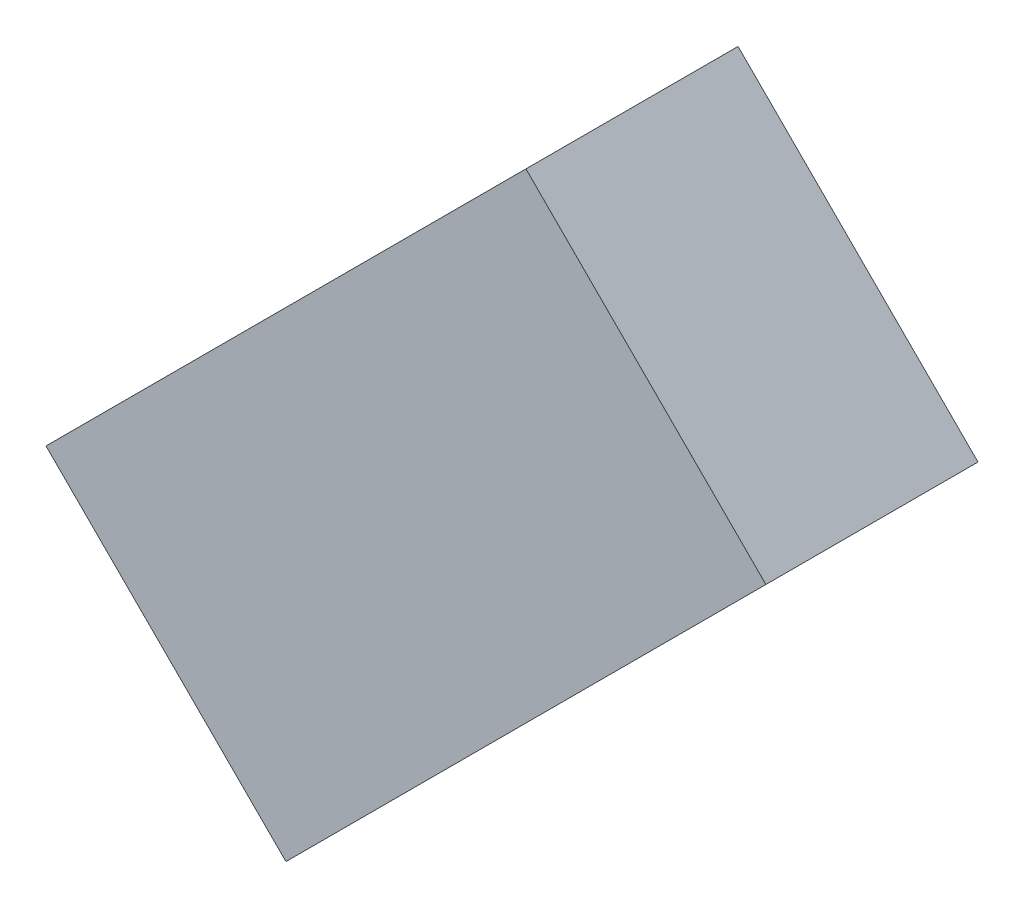
ISO-10303-21;
HEADER;
FILE_DESCRIPTION(('STEP AP214'),'2;1');
FILE_NAME('part.step','',(''),(''),'','','');
FILE_SCHEMA(('AUTOMOTIVE_DESIGN { 1 0 10303 214 1 1 1 1 }'));
ENDSEC;
DATA;
#1=APPLICATION_CONTEXT('core data for automotive mechanical design processes');
#2=APPLICATION_PROTOCOL_DEFINITION('international standard','automotive_design',2000,#1);
#3=PRODUCT_CONTEXT('',#1,'mechanical');
#4=PRODUCT('Part','Part','',(#3));
#5=PRODUCT_RELATED_PRODUCT_CATEGORY('part','',(#4));
#6=PRODUCT_DEFINITION_FORMATION('','',#4);
#7=PRODUCT_DEFINITION_CONTEXT('part definition',#1,'design');
#8=PRODUCT_DEFINITION('design','',#6,#7);
#9=PRODUCT_DEFINITION_SHAPE('','',#8);
#10=(LENGTH_UNIT() NAMED_UNIT(*) SI_UNIT(.MILLI.,.METRE.));
#11=(NAMED_UNIT(*) PLANE_ANGLE_UNIT() SI_UNIT($,.RADIAN.));
#12=(NAMED_UNIT(*) SI_UNIT($,.STERADIAN.) SOLID_ANGLE_UNIT());
#13=UNCERTAINTY_MEASURE_WITH_UNIT(LENGTH_MEASURE(1.E-05),#10,'distance_accuracy_value','');
#14=(GEOMETRIC_REPRESENTATION_CONTEXT(3) GLOBAL_UNCERTAINTY_ASSIGNED_CONTEXT((#13)) GLOBAL_UNIT_ASSIGNED_CONTEXT((#10,
#11,#12)) REPRESENTATION_CONTEXT('',''));
#15=CARTESIAN_POINT('',(0.,0.,0.));
#16=DIRECTION('',(0.,0.,1.));
#17=DIRECTION('',(1.,0.,0.));
#18=AXIS2_PLACEMENT_3D('',#15,#16,#17);
#19=CARTESIAN_POINT('',(0.84853018,0.28284932,0.499999));
#20=DIRECTION('',(0.,0.,-1.));
#21=DIRECTION('',(-1.,0.,0.));
#22=AXIS2_PLACEMENT_3D('',#19,#20,#21);
#23=PLANE('',#22);
#24=DIRECTION('',(0.707106781186548,0.707106781186548,0.));
#25=VECTOR('',#24,1.);
#26=CARTESIAN_POINT('',(0.28284424,0.84853018,0.499999));
#27=LINE('',#26,#25);
#28=CARTESIAN_POINT('',(0.282844239999973,0.848530179999973,0.499999));
#29=VERTEX_POINT('',#28);
#30=CARTESIAN_POINT('',(-0.84852764,-0.2828417,0.499999));
#31=VERTEX_POINT('',#30);
#32=EDGE_CURVE('E54',#29,#31,#27,.F.);
#33=ORIENTED_EDGE('',*,*,#32,.T.);
#34=DIRECTION('',(-0.707103606167919,0.707109956190919,0.));
#35=VECTOR('',#34,1.);
#36=CARTESIAN_POINT('',(-0.84852764,-0.2828417,0.499999));
#37=LINE('',#36,#35);
#38=CARTESIAN_POINT('',(-0.282846780000027,-0.848527640000027,0.499999));
#39=VERTEX_POINT('',#38);
#40=EDGE_CURVE('E57',#31,#39,#37,.F.);
#41=ORIENTED_EDGE('',*,*,#40,.T.);
#42=DIRECTION('',(-0.707106781186548,-0.707106781186548,0.));
#43=VECTOR('',#42,1.);
#44=CARTESIAN_POINT('',(-0.28284678,-0.84852764,0.499999));
#45=LINE('',#44,#43);
#46=CARTESIAN_POINT('',(0.84853018,0.28284932,0.499999));
#47=VERTEX_POINT('',#46);
#48=EDGE_CURVE('E59',#39,#47,#45,.F.);
#49=ORIENTED_EDGE('',*,*,#48,.T.);
#50=DIRECTION('',(0.707109956190785,-0.707103606168054,0.));
#51=VECTOR('',#50,1.);
#52=CARTESIAN_POINT('',(0.28284424,0.84853018,0.499999));
#53=LINE('',#52,#51);
#54=EDGE_CURVE('E19',#29,#47,#53,.T.);
#55=ORIENTED_EDGE('',*,*,#54,.F.);
#56=EDGE_LOOP('',(#33,#41,#49,#55));
#57=FACE_BOUND('',#56,.T.);
#58=ADVANCED_FACE('F16',(#57),#23,.F.);
#59=CARTESIAN_POINT('',(-0.28284678,-0.84852764,0.));
#60=DIRECTION('',(-0.707106781186548,0.707106781186548,0.));
#61=DIRECTION('',(-0.707106781186548,-0.707106781186548,0.));
#62=AXIS2_PLACEMENT_3D('',#59,#60,#61);
#63=PLANE('',#62);
#64=DIRECTION('',(0.,0.,1.));
#65=VECTOR('',#64,1.);
#66=CARTESIAN_POINT('',(0.84853018,0.28284932,0.));
#67=LINE('',#66,#65);
#68=CARTESIAN_POINT('',(0.84853018,0.28284932,0.));
#69=VERTEX_POINT('',#68);
#70=EDGE_CURVE('E70',#69,#47,#67,.T.);
#71=ORIENTED_EDGE('',*,*,#70,.T.);
#72=ORIENTED_EDGE('',*,*,#48,.F.);
#73=DIRECTION('',(0.,0.,1.));
#74=VECTOR('',#73,1.);
#75=CARTESIAN_POINT('',(-0.282846780000108,-0.848527640000108,0.));
#76=LINE('',#75,#74);
#77=CARTESIAN_POINT('',(-0.282846780000027,-0.848527640000027,0.));
#78=VERTEX_POINT('',#77);
#79=EDGE_CURVE('E64',#39,#78,#76,.F.);
#80=ORIENTED_EDGE('',*,*,#79,.T.);
#81=DIRECTION('',(-0.707106781186548,-0.707106781186548,0.));
#82=VECTOR('',#81,1.);
#83=CARTESIAN_POINT('',(0.84853018,0.28284932,0.));
#84=LINE('',#83,#82);
#85=EDGE_CURVE('E82',#69,#78,#84,.T.);
#86=ORIENTED_EDGE('',*,*,#85,.F.);
#87=EDGE_LOOP('',(#71,#72,#80,#86));
#88=FACE_BOUND('',#87,.T.);
#89=ADVANCED_FACE('F67',(#88),#63,.F.);
#90=CARTESIAN_POINT('',(-0.84852764,-0.2828417,0.));
#91=DIRECTION('',(0.707109956190919,0.707103606167919,0.));
#92=DIRECTION('',(-0.707103606167919,0.707109956190919,0.));
#93=AXIS2_PLACEMENT_3D('',#90,#91,#92);
#94=PLANE('',#93);
#95=ORIENTED_EDGE('',*,*,#79,.F.);
#96=ORIENTED_EDGE('',*,*,#40,.F.);
#97=DIRECTION('',(0.,0.,1.));
#98=VECTOR('',#97,1.);
#99=CARTESIAN_POINT('',(-0.84852764,-0.2828417,0.));
#100=LINE('',#99,#98);
#101=CARTESIAN_POINT('',(-0.84852764,-0.2828417,0.));
#102=VERTEX_POINT('',#101);
#103=EDGE_CURVE('E76',#31,#102,#100,.F.);
#104=ORIENTED_EDGE('',*,*,#103,.T.);
#105=DIRECTION('',(-0.707103606168054,0.707109956190785,0.));
#106=VECTOR('',#105,1.);
#107=CARTESIAN_POINT('',(-0.28284678,-0.84852764,0.));
#108=LINE('',#107,#106);
#109=EDGE_CURVE('E73',#78,#102,#108,.T.);
#110=ORIENTED_EDGE('',*,*,#109,.F.);
#111=EDGE_LOOP('',(#95,#96,#104,#110));
#112=FACE_BOUND('',#111,.T.);
#113=ADVANCED_FACE('F71',(#112),#94,.F.);
#114=CARTESIAN_POINT('',(0.28284424,0.84853018,0.));
#115=DIRECTION('',(0.707106781186548,-0.707106781186548,0.));
#116=DIRECTION('',(0.707106781186548,0.707106781186548,0.));
#117=AXIS2_PLACEMENT_3D('',#114,#115,#116);
#118=PLANE('',#117);
#119=ORIENTED_EDGE('',*,*,#103,.F.);
#120=ORIENTED_EDGE('',*,*,#32,.F.);
#121=DIRECTION('',(0.,0.,1.));
#122=VECTOR('',#121,1.);
#123=CARTESIAN_POINT('',(0.282844239999892,0.848530179999892,0.));
#124=LINE('',#123,#122);
#125=CARTESIAN_POINT('',(0.282844239999973,0.848530179999973,0.));
#126=VERTEX_POINT('',#125);
#127=EDGE_CURVE('E34',#29,#126,#124,.F.);
#128=ORIENTED_EDGE('',*,*,#127,.T.);
#129=DIRECTION('',(0.707106781186548,0.707106781186548,0.));
#130=VECTOR('',#129,1.);
#131=CARTESIAN_POINT('',(-0.84852764,-0.2828417,0.));
#132=LINE('',#131,#130);
#133=EDGE_CURVE('E25',#102,#126,#132,.T.);
#134=ORIENTED_EDGE('',*,*,#133,.F.);
#135=EDGE_LOOP('',(#119,#120,#128,#134));
#136=FACE_BOUND('',#135,.T.);
#137=ADVANCED_FACE('F88',(#136),#118,.F.);
#138=CARTESIAN_POINT('',(0.84853018,0.28284932,0.));
#139=DIRECTION('',(-0.707103606167919,-0.707109956190919,0.));
#140=DIRECTION('',(0.707109956190919,-0.707103606167919,0.));
#141=AXIS2_PLACEMENT_3D('',#138,#139,#140);
#142=PLANE('',#141);
#143=ORIENTED_EDGE('',*,*,#127,.F.);
#144=ORIENTED_EDGE('',*,*,#54,.T.);
#145=ORIENTED_EDGE('',*,*,#70,.F.);
#146=DIRECTION('',(0.707109956190785,-0.707103606168054,0.));
#147=VECTOR('',#146,1.);
#148=CARTESIAN_POINT('',(0.28284424,0.84853018,0.));
#149=LINE('',#148,#147);
#150=EDGE_CURVE('E11',#126,#69,#149,.T.);
#151=ORIENTED_EDGE('',*,*,#150,.F.);
#152=EDGE_LOOP('',(#143,#144,#145,#151));
#153=FACE_BOUND('',#152,.T.);
#154=ADVANCED_FACE('F90',(#153),#142,.F.);
#155=CARTESIAN_POINT('',(0.84853018,0.28284932,0.));
#156=DIRECTION('',(0.,0.,-1.));
#157=DIRECTION('',(-1.,0.,0.));
#158=AXIS2_PLACEMENT_3D('',#155,#156,#157);
#159=PLANE('',#158);
#160=ORIENTED_EDGE('',*,*,#133,.T.);
#161=ORIENTED_EDGE('',*,*,#150,.T.);
#162=ORIENTED_EDGE('',*,*,#85,.T.);
#163=ORIENTED_EDGE('',*,*,#109,.T.);
#164=EDGE_LOOP('',(#160,#161,#162,#163));
#165=FACE_BOUND('',#164,.T.);
#166=ADVANCED_FACE('F87',(#165),#159,.T.);
#167=CLOSED_SHELL('',(#58,#89,#113,#137,#154,#166));
#168=MANIFOLD_SOLID_BREP('B1',#167);
#169=ADVANCED_BREP_SHAPE_REPRESENTATION('',(#18,#168),#14);
#170=SHAPE_DEFINITION_REPRESENTATION(#9,#169);
ENDSEC;
END-ISO-10303-21;
